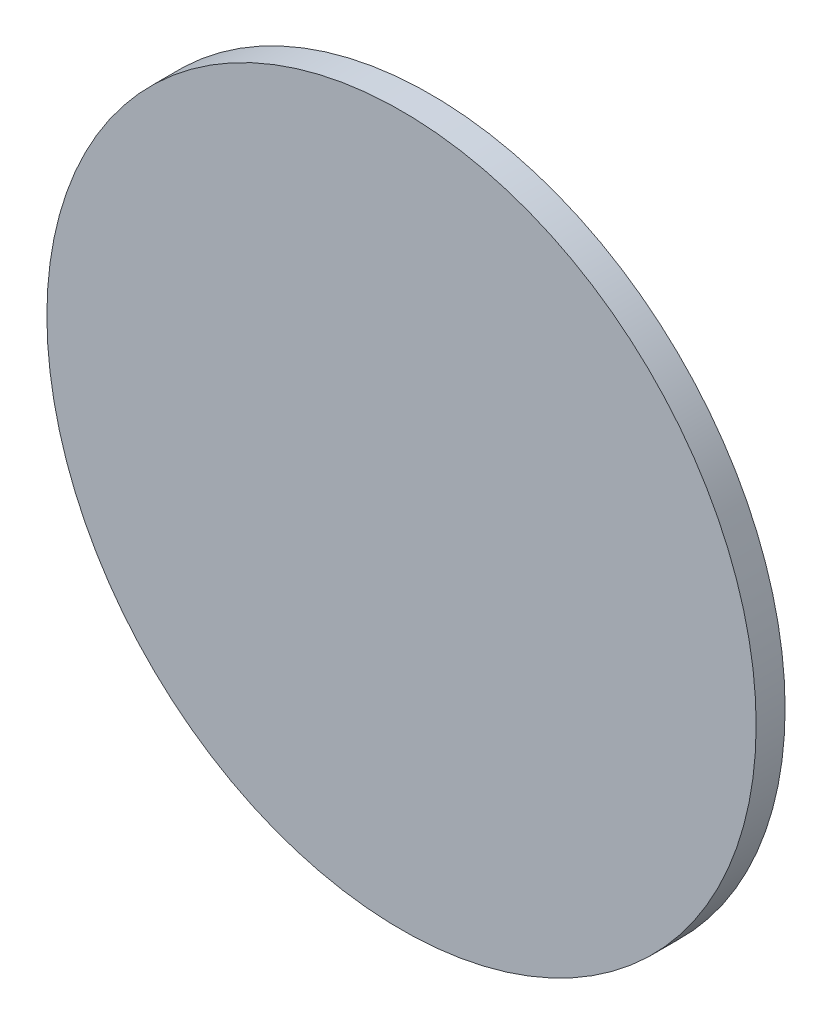
ISO-10303-21;
HEADER;
FILE_DESCRIPTION(('STEP AP214'),'2;1');
FILE_NAME('part.step','',(''),(''),'','','');
FILE_SCHEMA(('AUTOMOTIVE_DESIGN { 1 0 10303 214 1 1 1 1 }'));
ENDSEC;
DATA;
#1=APPLICATION_CONTEXT('core data for automotive mechanical design processes');
#2=APPLICATION_PROTOCOL_DEFINITION('international standard','automotive_design',2000,#1);
#3=PRODUCT_CONTEXT('',#1,'mechanical');
#4=PRODUCT('Part','Part','',(#3));
#5=PRODUCT_RELATED_PRODUCT_CATEGORY('part','',(#4));
#6=PRODUCT_DEFINITION_FORMATION('','',#4);
#7=PRODUCT_DEFINITION_CONTEXT('part definition',#1,'design');
#8=PRODUCT_DEFINITION('design','',#6,#7);
#9=PRODUCT_DEFINITION_SHAPE('','',#8);
#10=(LENGTH_UNIT() NAMED_UNIT(*) SI_UNIT(.MILLI.,.METRE.));
#11=(NAMED_UNIT(*) PLANE_ANGLE_UNIT() SI_UNIT($,.RADIAN.));
#12=(NAMED_UNIT(*) SI_UNIT($,.STERADIAN.) SOLID_ANGLE_UNIT());
#13=UNCERTAINTY_MEASURE_WITH_UNIT(LENGTH_MEASURE(1.E-05),#10,'distance_accuracy_value','');
#14=(GEOMETRIC_REPRESENTATION_CONTEXT(3) GLOBAL_UNCERTAINTY_ASSIGNED_CONTEXT((#13)) GLOBAL_UNIT_ASSIGNED_CONTEXT((#10,
#11,#12)) REPRESENTATION_CONTEXT('',''));
#15=CARTESIAN_POINT('',(0.,0.,0.));
#16=DIRECTION('',(0.,0.,1.));
#17=DIRECTION('',(1.,0.,0.));
#18=AXIS2_PLACEMENT_3D('',#15,#16,#17);
#19=CARTESIAN_POINT('',(0.,0.,10.));
#20=DIRECTION('',(0.,0.,-1.));
#21=DIRECTION('',(-1.,0.,0.));
#22=AXIS2_PLACEMENT_3D('',#19,#20,#21);
#23=CYLINDRICAL_SURFACE('',#22,122.5);
#24=CARTESIAN_POINT('',(0.,0.,10.));
#25=DIRECTION('',(0.,0.,1.));
#26=DIRECTION('',(1.,0.,0.));
#27=AXIS2_PLACEMENT_3D('',#24,#25,#26);
#28=CIRCLE('',#27,122.5);
#29=CARTESIAN_POINT('',(122.5,0.,10.));
#30=VERTEX_POINT('',#29);
#31=EDGE_CURVE('E10',#30,#30,#28,.T.);
#32=ORIENTED_EDGE('',*,*,#31,.F.);
#33=EDGE_LOOP('',(#32));
#34=FACE_BOUND('',#33,.T.);
#35=CARTESIAN_POINT('',(0.,0.,0.));
#36=DIRECTION('',(0.,0.,1.));
#37=DIRECTION('',(1.,0.,0.));
#38=AXIS2_PLACEMENT_3D('',#35,#36,#37);
#39=CIRCLE('',#38,122.5);
#40=CARTESIAN_POINT('',(122.5,0.,0.));
#41=VERTEX_POINT('',#40);
#42=EDGE_CURVE('E40',#41,#41,#39,.T.);
#43=ORIENTED_EDGE('',*,*,#42,.T.);
#44=EDGE_LOOP('',(#43));
#45=FACE_BOUND('',#44,.T.);
#46=ADVANCED_FACE('F37',(#34,#45),#23,.T.);
#47=CARTESIAN_POINT('',(0.,0.,10.));
#48=DIRECTION('',(0.,0.,1.));
#49=DIRECTION('',(1.,0.,0.));
#50=AXIS2_PLACEMENT_3D('',#47,#48,#49);
#51=PLANE('',#50);
#52=ORIENTED_EDGE('',*,*,#31,.T.);
#53=EDGE_LOOP('',(#52));
#54=FACE_BOUND('',#53,.T.);
#55=ADVANCED_FACE('F54',(#54),#51,.T.);
#56=CARTESIAN_POINT('',(0.,0.,0.));
#57=DIRECTION('',(0.,0.,1.));
#58=DIRECTION('',(1.,0.,0.));
#59=AXIS2_PLACEMENT_3D('',#56,#57,#58);
#60=PLANE('',#59);
#61=ORIENTED_EDGE('',*,*,#42,.F.);
#62=EDGE_LOOP('',(#61));
#63=FACE_BOUND('',#62,.T.);
#64=ADVANCED_FACE('F52',(#63),#60,.F.);
#65=CLOSED_SHELL('',(#46,#55,#64));
#66=MANIFOLD_SOLID_BREP('B2',#65);
#67=ADVANCED_BREP_SHAPE_REPRESENTATION('',(#18,#66),#14);
#68=SHAPE_DEFINITION_REPRESENTATION(#9,#67);
ENDSEC;
END-ISO-10303-21;
